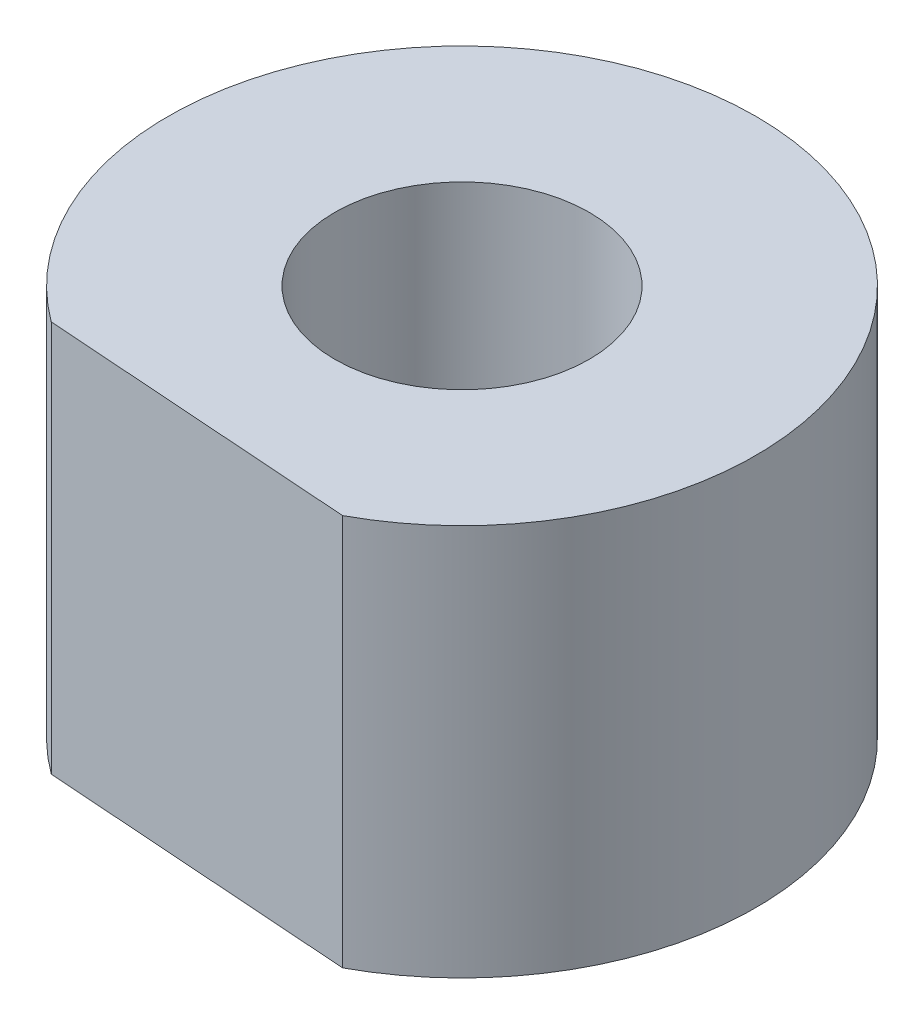
ISO-10303-21;
HEADER;
FILE_DESCRIPTION(('STEP AP214'),'2;1');
FILE_NAME('part.step','',(''),(''),'','','');
FILE_SCHEMA(('AUTOMOTIVE_DESIGN { 1 0 10303 214 1 1 1 1 }'));
ENDSEC;
DATA;
#1=APPLICATION_CONTEXT('core data for automotive mechanical design processes');
#2=APPLICATION_PROTOCOL_DEFINITION('international standard','automotive_design',2000,#1);
#3=PRODUCT_CONTEXT('',#1,'mechanical');
#4=PRODUCT('Part','Part','',(#3));
#5=PRODUCT_RELATED_PRODUCT_CATEGORY('part','',(#4));
#6=PRODUCT_DEFINITION_FORMATION('','',#4);
#7=PRODUCT_DEFINITION_CONTEXT('part definition',#1,'design');
#8=PRODUCT_DEFINITION('design','',#6,#7);
#9=PRODUCT_DEFINITION_SHAPE('','',#8);
#10=(LENGTH_UNIT() NAMED_UNIT(*) SI_UNIT(.MILLI.,.METRE.));
#11=(NAMED_UNIT(*) PLANE_ANGLE_UNIT() SI_UNIT($,.RADIAN.));
#12=(NAMED_UNIT(*) SI_UNIT($,.STERADIAN.) SOLID_ANGLE_UNIT());
#13=UNCERTAINTY_MEASURE_WITH_UNIT(LENGTH_MEASURE(1.E-05),#10,'distance_accuracy_value','');
#14=(GEOMETRIC_REPRESENTATION_CONTEXT(3) GLOBAL_UNCERTAINTY_ASSIGNED_CONTEXT((#13)) GLOBAL_UNIT_ASSIGNED_CONTEXT((#10,
#11,#12)) REPRESENTATION_CONTEXT('',''));
#15=CARTESIAN_POINT('',(0.,0.,0.));
#16=DIRECTION('',(0.,0.,1.));
#17=DIRECTION('',(1.,0.,0.));
#18=AXIS2_PLACEMENT_3D('',#15,#16,#17);
#19=CARTESIAN_POINT('',(0.,10.,0.));
#20=DIRECTION('',(0.,1.,0.));
#21=DIRECTION('',(0.,0.,1.));
#22=AXIS2_PLACEMENT_3D('',#19,#20,#21);
#23=PLANE('',#22);
#24=CARTESIAN_POINT('',(0.,10.,0.));
#25=DIRECTION('',(0.,1.,0.));
#26=DIRECTION('',(0.,0.,1.));
#27=AXIS2_PLACEMENT_3D('',#24,#25,#26);
#28=CIRCLE('',#27,7.5);
#29=CARTESIAN_POINT('',(3.55423901346271,10.,6.60434592031487));
#30=VERTEX_POINT('',#29);
#31=CARTESIAN_POINT('',(-4.44576098653729,10.,6.04029877163232));
#32=VERTEX_POINT('',#31);
#33=EDGE_CURVE('E63',#30,#32,#28,.T.);
#34=ORIENTED_EDGE('',*,*,#33,.T.);
#35=DIRECTION('',(0.997523688129957,0.,0.0703312990041248));
#36=VECTOR('',#35,1.);
#37=CARTESIAN_POINT('',(-4.44576098653729,10.,6.04029877163232));
#38=LINE('',#37,#36);
#39=EDGE_CURVE('E48',#32,#30,#38,.T.);
#40=ORIENTED_EDGE('',*,*,#39,.T.);
#41=EDGE_LOOP('',(#34,#40));
#42=FACE_BOUND('',#41,.T.);
#43=CARTESIAN_POINT('',(0.,10.,0.));
#44=DIRECTION('',(0.,1.,0.));
#45=DIRECTION('',(0.,0.,1.));
#46=AXIS2_PLACEMENT_3D('',#43,#44,#45);
#47=CIRCLE('',#46,3.25);
#48=CARTESIAN_POINT('',(0.,10.,3.25));
#49=VERTEX_POINT('',#48);
#50=EDGE_CURVE('E69',#49,#49,#47,.T.);
#51=ORIENTED_EDGE('',*,*,#50,.F.);
#52=EDGE_LOOP('',(#51));
#53=FACE_BOUND('',#52,.T.);
#54=ADVANCED_FACE('F32',(#42,#53),#23,.T.);
#55=CARTESIAN_POINT('',(0.,0.,0.));
#56=DIRECTION('',(0.,1.,0.));
#57=DIRECTION('',(0.,0.,1.));
#58=AXIS2_PLACEMENT_3D('',#55,#56,#57);
#59=PLANE('',#58);
#60=CARTESIAN_POINT('',(0.,0.,0.));
#61=DIRECTION('',(0.,1.,0.));
#62=DIRECTION('',(0.,0.,1.));
#63=AXIS2_PLACEMENT_3D('',#60,#61,#62);
#64=CIRCLE('',#63,7.5);
#65=CARTESIAN_POINT('',(3.55423901346271,0.,6.60434592031487));
#66=VERTEX_POINT('',#65);
#67=CARTESIAN_POINT('',(-4.44576098653729,0.,6.04029877163232));
#68=VERTEX_POINT('',#67);
#69=EDGE_CURVE('E64',#66,#68,#64,.T.);
#70=ORIENTED_EDGE('',*,*,#69,.F.);
#71=DIRECTION('',(0.997523688129957,0.,0.0703312990041248));
#72=VECTOR('',#71,1.);
#73=CARTESIAN_POINT('',(-4.44576098653729,0.,6.04029877163232));
#74=LINE('',#73,#72);
#75=EDGE_CURVE('E56',#68,#66,#74,.T.);
#76=ORIENTED_EDGE('',*,*,#75,.F.);
#77=EDGE_LOOP('',(#70,#76));
#78=FACE_BOUND('',#77,.T.);
#79=CARTESIAN_POINT('',(0.,0.,0.));
#80=DIRECTION('',(0.,1.,0.));
#81=DIRECTION('',(0.,0.,1.));
#82=AXIS2_PLACEMENT_3D('',#79,#80,#81);
#83=CIRCLE('',#82,3.25);
#84=CARTESIAN_POINT('',(0.,0.,3.25));
#85=VERTEX_POINT('',#84);
#86=EDGE_CURVE('E72',#85,#85,#83,.T.);
#87=ORIENTED_EDGE('',*,*,#86,.T.);
#88=EDGE_LOOP('',(#87));
#89=FACE_BOUND('',#88,.T.);
#90=ADVANCED_FACE('F67',(#78,#89),#59,.F.);
#91=CARTESIAN_POINT('',(0.,10.,0.));
#92=DIRECTION('',(0.,-1.,0.));
#93=DIRECTION('',(0.,0.,-1.));
#94=AXIS2_PLACEMENT_3D('',#91,#92,#93);
#95=CYLINDRICAL_SURFACE('',#94,7.5);
#96=ORIENTED_EDGE('',*,*,#69,.T.);
#97=DIRECTION('',(0.,-1.,0.));
#98=VECTOR('',#97,1.);
#99=CARTESIAN_POINT('',(-4.44576098653729,10.,6.04029877163232));
#100=LINE('',#99,#98);
#101=EDGE_CURVE('E11',#32,#68,#100,.T.);
#102=ORIENTED_EDGE('',*,*,#101,.F.);
#103=ORIENTED_EDGE('',*,*,#33,.F.);
#104=DIRECTION('',(0.,-1.,0.));
#105=VECTOR('',#104,1.);
#106=CARTESIAN_POINT('',(3.55423901346271,10.,6.60434592031487));
#107=LINE('',#106,#105);
#108=EDGE_CURVE('E41',#30,#66,#107,.T.);
#109=ORIENTED_EDGE('',*,*,#108,.T.);
#110=EDGE_LOOP('',(#96,#102,#103,#109));
#111=FACE_BOUND('',#110,.T.);
#112=ADVANCED_FACE('F34',(#111),#95,.T.);
#113=CARTESIAN_POINT('',(-4.44576098653729,10.,6.04029877163232));
#114=DIRECTION('',(0.0703312990041248,0.,-0.997523688129957));
#115=DIRECTION('',(-0.997523688129957,0.,-0.0703312990041248));
#116=AXIS2_PLACEMENT_3D('',#113,#114,#115);
#117=PLANE('',#116);
#118=ORIENTED_EDGE('',*,*,#75,.T.);
#119=ORIENTED_EDGE('',*,*,#108,.F.);
#120=ORIENTED_EDGE('',*,*,#39,.F.);
#121=ORIENTED_EDGE('',*,*,#101,.T.);
#122=EDGE_LOOP('',(#118,#119,#120,#121));
#123=FACE_BOUND('',#122,.T.);
#124=ADVANCED_FACE('F59',(#123),#117,.F.);
#125=CARTESIAN_POINT('',(0.,10.,0.));
#126=DIRECTION('',(0.,-1.,0.));
#127=DIRECTION('',(0.,0.,-1.));
#128=AXIS2_PLACEMENT_3D('',#125,#126,#127);
#129=CYLINDRICAL_SURFACE('',#128,3.25);
#130=ORIENTED_EDGE('',*,*,#50,.T.);
#131=EDGE_LOOP('',(#130));
#132=FACE_BOUND('',#131,.T.);
#133=ORIENTED_EDGE('',*,*,#86,.F.);
#134=EDGE_LOOP('',(#133));
#135=FACE_BOUND('',#134,.T.);
#136=ADVANCED_FACE('F80',(#132,#135),#129,.F.);
#137=CLOSED_SHELL('',(#54,#90,#112,#124,#136));
#138=MANIFOLD_SOLID_BREP('B2',#137);
#139=ADVANCED_BREP_SHAPE_REPRESENTATION('',(#18,#138),#14);
#140=SHAPE_DEFINITION_REPRESENTATION(#9,#139);
ENDSEC;
END-ISO-10303-21;
